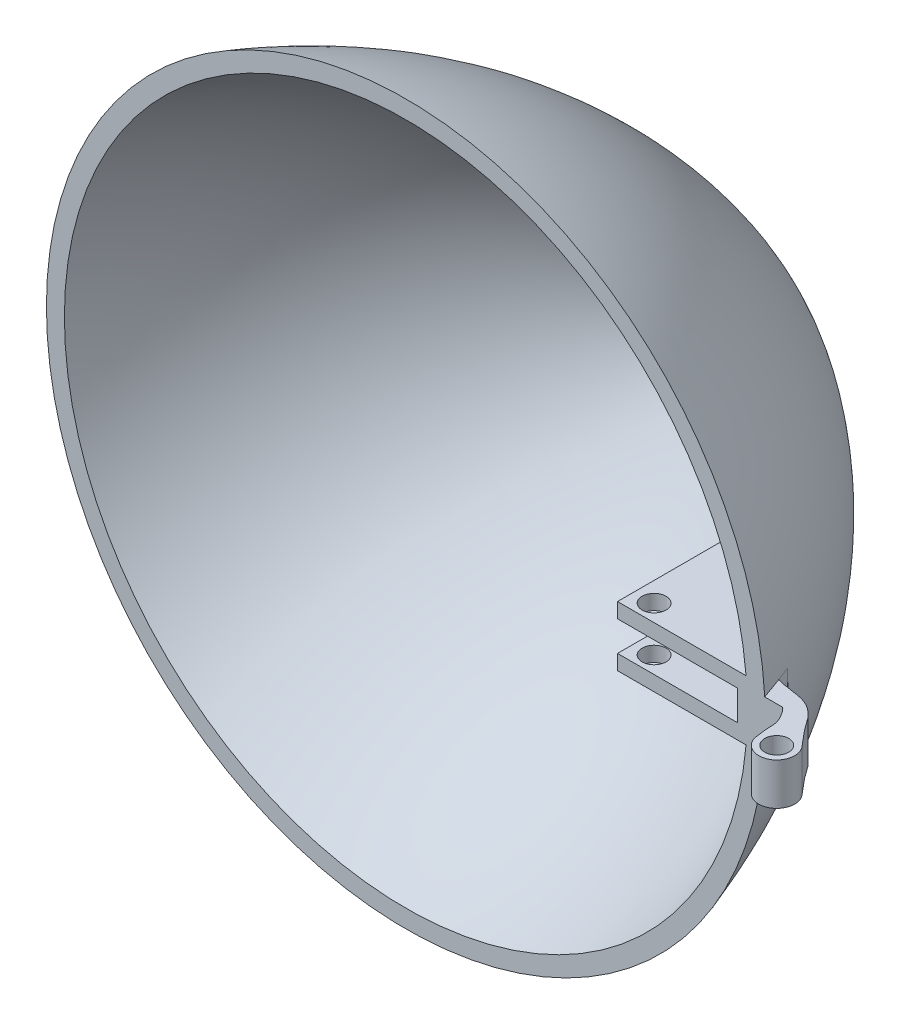
ISO-10303-21;
HEADER;
FILE_DESCRIPTION(('STEP AP214'),'2;1');
FILE_NAME('part.step','',(''),(''),'','','');
FILE_SCHEMA(('AUTOMOTIVE_DESIGN { 1 0 10303 214 1 1 1 1 }'));
ENDSEC;
DATA;
#1=APPLICATION_CONTEXT('core data for automotive mechanical design processes');
#2=APPLICATION_PROTOCOL_DEFINITION('international standard','automotive_design',2000,#1);
#3=PRODUCT_CONTEXT('',#1,'mechanical');
#4=PRODUCT('Part','Part','',(#3));
#5=PRODUCT_RELATED_PRODUCT_CATEGORY('part','',(#4));
#6=PRODUCT_DEFINITION_FORMATION('','',#4);
#7=PRODUCT_DEFINITION_CONTEXT('part definition',#1,'design');
#8=PRODUCT_DEFINITION('design','',#6,#7);
#9=PRODUCT_DEFINITION_SHAPE('','',#8);
#10=(LENGTH_UNIT() NAMED_UNIT(*) SI_UNIT(.MILLI.,.METRE.));
#11=(NAMED_UNIT(*) PLANE_ANGLE_UNIT() SI_UNIT($,.RADIAN.));
#12=(NAMED_UNIT(*) SI_UNIT($,.STERADIAN.) SOLID_ANGLE_UNIT());
#13=UNCERTAINTY_MEASURE_WITH_UNIT(LENGTH_MEASURE(1.E-05),#10,'distance_accuracy_value','');
#14=(GEOMETRIC_REPRESENTATION_CONTEXT(3) GLOBAL_UNCERTAINTY_ASSIGNED_CONTEXT((#13)) GLOBAL_UNIT_ASSIGNED_CONTEXT((#10,
#11,#12)) REPRESENTATION_CONTEXT('',''));
#15=CARTESIAN_POINT('',(0.,0.,0.));
#16=DIRECTION('',(0.,0.,1.));
#17=DIRECTION('',(1.,0.,0.));
#18=AXIS2_PLACEMENT_3D('',#15,#16,#17);
#19=CARTESIAN_POINT('',(17.6619486107275,2.5,-30.002));
#20=DIRECTION('',(-1.,0.,0.));
#21=DIRECTION('',(0.,0.,1.));
#22=AXIS2_PLACEMENT_3D('',#19,#20,#21);
#23=PLANE('',#22);
#24=DIRECTION('',(0.,0.,1.));
#25=VECTOR('',#24,1.);
#26=CARTESIAN_POINT('',(17.6619486107275,1.25,-30.003));
#27=LINE('',#26,#25);
#28=CARTESIAN_POINT('',(17.6619486107275,1.25,-17.5607541889131));
#29=VERTEX_POINT('',#28);
#30=CARTESIAN_POINT('',(17.6619486107275,1.25,0.));
#31=VERTEX_POINT('',#30);
#32=EDGE_CURVE('E103',#29,#31,#27,.T.);
#33=ORIENTED_EDGE('',*,*,#32,.T.);
#34=DIRECTION('',(0.,-1.,0.));
#35=VECTOR('',#34,1.);
#36=CARTESIAN_POINT('',(17.6619486107275,2.5,0.));
#37=LINE('',#36,#35);
#38=CARTESIAN_POINT('',(17.6619486107275,2.5,0.));
#39=VERTEX_POINT('',#38);
#40=EDGE_CURVE('E216',#39,#31,#37,.T.);
#41=ORIENTED_EDGE('',*,*,#40,.F.);
#42=DIRECTION('',(0.,0.,1.));
#43=VECTOR('',#42,1.);
#44=CARTESIAN_POINT('',(17.6619486107275,2.5,-30.002));
#45=LINE('',#44,#43);
#46=CARTESIAN_POINT('',(17.6619486107275,2.5,-17.4275613271101));
#47=VERTEX_POINT('',#46);
#48=EDGE_CURVE('E228',#47,#39,#45,.T.);
#49=ORIENTED_EDGE('',*,*,#48,.F.);
#50=CARTESIAN_POINT('',(17.6619486107275,-2.5,-17.4275613271101));
#51=CARTESIAN_POINT('',(17.6619486107275,-2.33364452662842,-17.4512148888771));
#52=CARTESIAN_POINT('',(17.6619486107275,-2.16695716753275,-17.4725414811833));
#53=CARTESIAN_POINT('',(17.6619486107275,-1.8335800516303,-17.5104322515211));
#54=CARTESIAN_POINT('',(17.6619486107275,-1.66689199384202,-17.5270113835337));
#55=CARTESIAN_POINT('',(17.6619486107275,-1.33351393835268,-17.5554158855967));
#56=CARTESIAN_POINT('',(17.6619486107275,-1.16682490558671,-17.5672525700897));
#57=CARTESIAN_POINT('',(17.6619486107275,-0.833446184973771,-17.5861817283973));
#58=CARTESIAN_POINT('',(17.6619486107275,-0.666756928281093,-17.5932817923936));
#59=CARTESIAN_POINT('',(17.6619486107275,-0.333378375504051,-17.6027443708301));
#60=CARTESIAN_POINT('',(17.6619486107275,-0.166689187752026,-17.6051106993557));
#61=CARTESIAN_POINT('',(17.6619486107275,0.166689187752024,-17.6051106993557));
#62=CARTESIAN_POINT('',(17.6619486107275,0.333378375504049,-17.6027443708301));
#63=CARTESIAN_POINT('',(17.6619486107275,0.66675692828109,-17.5932817923936));
#64=CARTESIAN_POINT('',(17.6619486107275,0.833446184973769,-17.5861817283973));
#65=CARTESIAN_POINT('',(17.6619486107275,1.16682490558671,-17.5672525700897));
#66=CARTESIAN_POINT('',(17.6619486107275,1.33351393835267,-17.5554158855967));
#67=CARTESIAN_POINT('',(17.6619486107275,1.66689199384202,-17.5270113835337));
#68=CARTESIAN_POINT('',(17.6619486107275,1.8335800516303,-17.5104322515211));
#69=CARTESIAN_POINT('',(17.6619486107275,2.16695716753275,-17.4725414811833));
#70=CARTESIAN_POINT('',(17.6619486107275,2.33364452662842,-17.4512148888771));
#71=CARTESIAN_POINT('',(17.6619486107275,2.5,-17.4275613271101));
#72=B_SPLINE_CURVE_WITH_KNOTS('',3,(#50,#51,#52,#53,#54,#55,#56,#57,#58,#59,#60,#61,#62,#63,#64,
#65,#66,#67,#68,#69,#70,#71),.UNSPECIFIED.,.F.,.F.,(4,2,2,2,2,2,2,2,2,2,4),(0.,
0.504071068011739,1.00653644814482,1.50779581357835,2.00824999575827,2.50830078720154,
3.00835157864481,3.50880576082473,4.01006512625825,4.51253050639134,5.01660157440307),.UNSPECIFIED.);
#73=EDGE_CURVE('E263',#29,#47,#72,.T.);
#74=ORIENTED_EDGE('',*,*,#73,.F.);
#75=EDGE_LOOP('',(#33,#41,#49,#74));
#76=FACE_BOUND('',#75,.T.);
#77=ADVANCED_FACE('F84',(#76),#23,.T.);
#78=CARTESIAN_POINT('',(19.3038889824878,30.001,-1.41072564130724));
#79=DIRECTION('',(0.,-1.,0.));
#80=DIRECTION('',(0.,0.,-1.));
#81=AXIS2_PLACEMENT_3D('',#78,#79,#80);
#82=CYLINDRICAL_SURFACE('',#81,1.);
#83=CARTESIAN_POINT('',(19.3038889824878,1.25,-1.41072564130724));
#84=DIRECTION('',(0.,1.,0.));
#85=DIRECTION('',(0.,0.,1.));
#86=AXIS2_PLACEMENT_3D('',#83,#84,#85);
#87=CIRCLE('',#86,1.);
#88=CARTESIAN_POINT('',(19.3038889824878,1.25,-0.410725641307243));
#89=VERTEX_POINT('',#88);
#90=EDGE_CURVE('E90',#89,#89,#87,.F.);
#91=ORIENTED_EDGE('',*,*,#90,.T.);
#92=EDGE_LOOP('',(#91));
#93=FACE_BOUND('',#92,.T.);
#94=CARTESIAN_POINT('',(19.3038889824878,2.5,-1.41072564130724));
#95=DIRECTION('',(0.,1.,0.));
#96=DIRECTION('',(0.,0.,1.));
#97=AXIS2_PLACEMENT_3D('',#94,#95,#96);
#98=CIRCLE('',#97,1.);
#99=CARTESIAN_POINT('',(19.3038889824878,2.5,-0.410725641307243));
#100=VERTEX_POINT('',#99);
#101=EDGE_CURVE('E569',#100,#100,#98,.F.);
#102=ORIENTED_EDGE('',*,*,#101,.F.);
#103=EDGE_LOOP('',(#102));
#104=FACE_BOUND('',#103,.T.);
#105=ADVANCED_FACE('F280',(#93,#104),#82,.F.);
#106=CARTESIAN_POINT('',(28.208129485491,1.75,-3.));
#107=DIRECTION('',(0.,1.,0.));
#108=DIRECTION('',(0.,0.,1.));
#109=AXIS2_PLACEMENT_3D('',#106,#107,#108);
#110=PLANE('',#109);
#111=CARTESIAN_POINT('',(33.9489148384378,1.75,3.));
#112=DIRECTION('',(0.,1.,0.));
#113=DIRECTION('',(0.,0.,1.));
#114=AXIS2_PLACEMENT_3D('',#111,#112,#113);
#115=CIRCLE('',#114,0.999999999999998);
#116=CARTESIAN_POINT('',(33.9489148384378,1.75,4.));
#117=VERTEX_POINT('',#116);
#118=EDGE_CURVE('E336',#117,#117,#115,.T.);
#119=ORIENTED_EDGE('',*,*,#118,.F.);
#120=EDGE_LOOP('',(#119));
#121=FACE_BOUND('',#120,.T.);
#122=CARTESIAN_POINT('',(28.8289906398202,1.75,-3.));
#123=CARTESIAN_POINT('',(28.8958930428877,1.75,-2.83510517042609));
#124=CARTESIAN_POINT('',(28.9620019711612,1.75,-2.66988864593124));
#125=CARTESIAN_POINT('',(29.0926355045824,1.75,-2.33886351445349));
#126=CARTESIAN_POINT('',(29.1571603825275,1.75,-2.17305501513178));
#127=CARTESIAN_POINT('',(29.2846462643894,1.75,-1.84085403238236));
#128=CARTESIAN_POINT('',(29.3476073997087,1.75,-1.67446159937317));
#129=CARTESIAN_POINT('',(29.4719856416756,1.75,-1.3411012629893));
#130=CARTESIAN_POINT('',(29.5334027528663,1.75,-1.17413336130943));
#131=CARTESIAN_POINT('',(29.6547130858508,1.75,-0.839628492746256));
#132=CARTESIAN_POINT('',(29.714606174192,1.75,-0.672091477474023));
#133=CARTESIAN_POINT('',(29.8328879495773,1.75,-0.336455215599502));
#134=CARTESIAN_POINT('',(29.8912763794571,1.75,-0.168355878364052));
#135=CARTESIAN_POINT('',(29.9489148384378,1.75,0.));
#136=B_SPLINE_CURVE_WITH_KNOTS('',3,(#122,#123,#124,#125,#126,#127,#128,#129,#130,#131,#132,
#133,#134,#135),.UNSPECIFIED.,.F.,.F.,(4,2,2,2,2,2,4),(0.,0.533847900146102,1.0676032093434,
1.60131351394715,2.135022248059,2.66877755720198,3.20262349452704),.UNSPECIFIED.);
#137=CARTESIAN_POINT('',(29.2879120528032,1.75,-1.83149184484965));
#138=VERTEX_POINT('',#137);
#139=CARTESIAN_POINT('',(29.9489148384378,1.75,0.));
#140=VERTEX_POINT('',#139);
#141=EDGE_CURVE('E298',#138,#140,#136,.T.);
#142=ORIENTED_EDGE('',*,*,#141,.T.);
#143=DIRECTION('',(1.,0.,0.));
#144=VECTOR('',#143,1.);
#145=CARTESIAN_POINT('',(0.,1.75,0.));
#146=LINE('',#145,#144);
#147=CARTESIAN_POINT('',(31.4313327643912,1.75,-7.66703696787174E-10));
#148=VERTEX_POINT('',#147);
#149=EDGE_CURVE('E376',#140,#148,#146,.T.);
#150=ORIENTED_EDGE('',*,*,#149,.T.);
#151=CARTESIAN_POINT('',(32.463099635242,1.75,3.20579888714997));
#152=CARTESIAN_POINT('',(32.3452183472964,1.75,2.53893952637464));
#153=CARTESIAN_POINT('',(32.3358643431977,1.75,1.83818950671229));
#154=CARTESIAN_POINT('',(32.3239378931179,1.75,1.53750983419818));
#155=CARTESIAN_POINT('',(32.2207148251797,1.75,1.14850300274605));
#156=CARTESIAN_POINT('',(32.0474459292414,1.75,0.783027828767226));
#157=CARTESIAN_POINT('',(31.2805712905834,1.75,-0.484912370915835));
#158=CARTESIAN_POINT('',(30.8417224009911,1.75,-0.0233901476595534));
#159=CARTESIAN_POINT('',(29.9489148384378,1.75,0.));
#160=B_SPLINE_CURVE_WITH_KNOTS('',3,(#151,#152,#153,#154,#155,#156,#157,#158,#159),
.UNSPECIFIED.,.F.,.F.,(4,1,1,1,1,1,4),(0.760748360647624,0.802714162680243,0.833252761763399,
0.866534985901637,0.873756945371258,0.905472356459606,1.),.UNSPECIFIED.);
#161=CARTESIAN_POINT('',(32.463099635242,1.75,3.20579888714997));
#162=VERTEX_POINT('',#161);
#163=EDGE_CURVE('E386',#162,#148,#160,.T.);
#164=ORIENTED_EDGE('',*,*,#163,.F.);
#165=CARTESIAN_POINT('',(33.9489148384378,1.75,3.));
#166=DIRECTION('',(0.,1.,0.));
#167=DIRECTION('',(0.,0.,1.));
#168=AXIS2_PLACEMENT_3D('',#165,#166,#167);
#169=CIRCLE('',#168,1.5);
#170=CARTESIAN_POINT('',(35.0280654497554,1.75,1.958158381474));
#171=VERTEX_POINT('',#170);
#172=EDGE_CURVE('E383',#162,#171,#169,.T.);
#173=ORIENTED_EDGE('',*,*,#172,.T.);
#174=CARTESIAN_POINT('',(29.2879120528032,1.75,-1.83149184484968));
#175=CARTESIAN_POINT('',(30.1235676782013,1.75,-1.5620717663439));
#176=CARTESIAN_POINT('',(31.4982305797862,1.75,-1.64009568049671));
#177=CARTESIAN_POINT('',(32.9560632797869,1.75,-0.719190623688149));
#178=CARTESIAN_POINT('',(33.6422187716804,1.75,0.196212236466457));
#179=CARTESIAN_POINT('',(34.1195707770958,1.75,0.930905219807041));
#180=CARTESIAN_POINT('',(34.8127024054398,1.75,1.70003850267874));
#181=CARTESIAN_POINT('',(35.0280654497554,1.75,1.95815838147401));
#182=B_SPLINE_CURVE_WITH_KNOTS('',3,(#174,#175,#176,#177,#178,#179,#180,#181),.UNSPECIFIED.,.F.,
.F.,(4,1,1,1,1,4),(0.,0.153474464426335,0.218322405433181,0.290372076581156,0.338209132320418,
0.39567089543696),.UNSPECIFIED.);
#183=EDGE_CURVE('E382',#138,#171,#182,.T.);
#184=ORIENTED_EDGE('',*,*,#183,.F.);
#185=EDGE_LOOP('',(#142,#150,#164,#173,#184));
#186=FACE_BOUND('',#185,.T.);
#187=ADVANCED_FACE('F285',(#121,#186),#110,.T.);
#188=CARTESIAN_POINT('',(28.208129485491,-1.75,-3.));
#189=DIRECTION('',(0.,-1.,0.));
#190=DIRECTION('',(0.,0.,-1.));
#191=AXIS2_PLACEMENT_3D('',#188,#189,#190);
#192=PLANE('',#191);
#193=CARTESIAN_POINT('',(33.9489148384378,-1.75,3.));
#194=DIRECTION('',(0.,-1.,0.));
#195=DIRECTION('',(0.,0.,-1.));
#196=AXIS2_PLACEMENT_3D('',#193,#194,#195);
#197=CIRCLE('',#196,0.999999999999998);
#198=CARTESIAN_POINT('',(33.9489148384378,-1.75,4.));
#199=VERTEX_POINT('',#198);
#200=EDGE_CURVE('E313',#199,#199,#197,.T.);
#201=ORIENTED_EDGE('',*,*,#200,.F.);
#202=EDGE_LOOP('',(#201));
#203=FACE_BOUND('',#202,.T.);
#204=CARTESIAN_POINT('',(32.463099635242,-1.75,3.20579888714997));
#205=CARTESIAN_POINT('',(32.3452183472964,-1.75,2.53893952637464));
#206=CARTESIAN_POINT('',(32.3358643431977,-1.75,1.83818950671229));
#207=CARTESIAN_POINT('',(32.3239378931179,-1.75,1.53750983419818));
#208=CARTESIAN_POINT('',(32.2207148251797,-1.75,1.14850300274605));
#209=CARTESIAN_POINT('',(32.0474459292414,-1.75,0.783027828767226));
#210=CARTESIAN_POINT('',(31.2805712905834,-1.75,-0.484912370915835));
#211=CARTESIAN_POINT('',(30.8417224009911,-1.75,-0.0233901476595534));
#212=CARTESIAN_POINT('',(29.9489148384378,-1.75,0.));
#213=B_SPLINE_CURVE_WITH_KNOTS('',3,(#204,#205,#206,#207,#208,#209,#210,#211,#212),
.UNSPECIFIED.,.F.,.F.,(4,1,1,1,1,1,4),(0.760748360647624,0.802714162680243,0.833252761763399,
0.866534985901637,0.873756945371258,0.905472356459606,1.),.UNSPECIFIED.);
#214=CARTESIAN_POINT('',(31.4313327643912,-1.75,-7.66703696787174E-10));
#215=VERTEX_POINT('',#214);
#216=CARTESIAN_POINT('',(32.463099635242,-1.75,3.20579888714997));
#217=VERTEX_POINT('',#216);
#218=EDGE_CURVE('E95',#215,#217,#213,.F.);
#219=ORIENTED_EDGE('',*,*,#218,.F.);
#220=DIRECTION('',(-1.,0.,0.));
#221=VECTOR('',#220,1.);
#222=CARTESIAN_POINT('',(28.208129485491,-1.75,0.));
#223=LINE('',#222,#221);
#224=CARTESIAN_POINT('',(29.9489148384378,-1.75,0.));
#225=VERTEX_POINT('',#224);
#226=EDGE_CURVE('E12',#215,#225,#223,.T.);
#227=ORIENTED_EDGE('',*,*,#226,.T.);
#228=CARTESIAN_POINT('',(29.9489148384378,-1.75,0.));
#229=CARTESIAN_POINT('',(29.8912763794571,-1.75,-0.168355878364052));
#230=CARTESIAN_POINT('',(29.8328879495773,-1.75,-0.336455215599503));
#231=CARTESIAN_POINT('',(29.714606174192,-1.75,-0.672091477474024));
#232=CARTESIAN_POINT('',(29.6547130858508,-1.75,-0.839628492746256));
#233=CARTESIAN_POINT('',(29.5334027528663,-1.75,-1.17413336130943));
#234=CARTESIAN_POINT('',(29.4719856416756,-1.75,-1.3411012629893));
#235=CARTESIAN_POINT('',(29.3476073997087,-1.75,-1.67446159937317));
#236=CARTESIAN_POINT('',(29.2846462643894,-1.75,-1.84085403238236));
#237=CARTESIAN_POINT('',(29.1571603825275,-1.75,-2.17305501513178));
#238=CARTESIAN_POINT('',(29.0926355045824,-1.75,-2.33886351445349));
#239=CARTESIAN_POINT('',(28.9620019711612,-1.75,-2.66988864593124));
#240=CARTESIAN_POINT('',(28.8958930428877,-1.75,-2.83510517042609));
#241=CARTESIAN_POINT('',(28.8289906398202,-1.75000000000001,-3.));
#242=B_SPLINE_CURVE_WITH_KNOTS('',3,(#228,#229,#230,#231,#232,#233,#234,#235,#236,#237,#238,
#239,#240,#241),.UNSPECIFIED.,.F.,.F.,(4,2,2,2,2,2,4),(0.,0.533845937325056,1.06760124646804,
1.60130998057989,2.13502028518364,2.66877559438094,3.20262349452704),.UNSPECIFIED.);
#243=CARTESIAN_POINT('',(29.2879081029253,-1.75,-1.83149037032838));
#244=VERTEX_POINT('',#243);
#245=EDGE_CURVE('E290',#225,#244,#242,.T.);
#246=ORIENTED_EDGE('',*,*,#245,.T.);
#247=CARTESIAN_POINT('',(29.2879120528032,-1.75,-1.83149184484968));
#248=CARTESIAN_POINT('',(30.1235676782013,-1.75,-1.5620717663439));
#249=CARTESIAN_POINT('',(31.4982305797862,-1.75,-1.64009568049671));
#250=CARTESIAN_POINT('',(32.9560632797869,-1.75,-0.719190623688149));
#251=CARTESIAN_POINT('',(33.6422187716804,-1.75,0.196212236466457));
#252=CARTESIAN_POINT('',(34.1195707770958,-1.75,0.930905219807041));
#253=CARTESIAN_POINT('',(34.8127024054398,-1.75,1.70003850267874));
#254=CARTESIAN_POINT('',(35.0280654497554,-1.75,1.95815838147401));
#255=B_SPLINE_CURVE_WITH_KNOTS('',3,(#247,#248,#249,#250,#251,#252,#253,#254),.UNSPECIFIED.,.F.,
.F.,(4,1,1,1,1,4),(0.,0.153474464426335,0.218322405433181,0.290372076581156,0.338209132320418,
0.39567089543696),.UNSPECIFIED.);
#256=CARTESIAN_POINT('',(35.0280654497554,-1.75,1.958158381474));
#257=VERTEX_POINT('',#256);
#258=EDGE_CURVE('E317',#257,#244,#255,.F.);
#259=ORIENTED_EDGE('',*,*,#258,.F.);
#260=CARTESIAN_POINT('',(33.9489148384378,-1.75,3.));
#261=DIRECTION('',(0.,-1.,0.));
#262=DIRECTION('',(0.,0.,-1.));
#263=AXIS2_PLACEMENT_3D('',#260,#261,#262);
#264=CIRCLE('',#263,1.5);
#265=EDGE_CURVE('E588',#257,#217,#264,.T.);
#266=ORIENTED_EDGE('',*,*,#265,.T.);
#267=EDGE_LOOP('',(#219,#227,#246,#259,#266));
#268=FACE_BOUND('',#267,.T.);
#269=ADVANCED_FACE('F281',(#203,#268),#192,.T.);
#270=CARTESIAN_POINT('',(0.,0.,-30.));
#271=CARTESIAN_POINT('',(-22.3404647460289,0.,-22.4108545765137));
#272=CARTESIAN_POINT('',(-30.,0.,0.));
#273=B_SPLINE_CURVE_WITH_KNOTS('',2,(#270,#271,#272),.UNSPECIFIED.,.F.,.F.,(3,3),(0.,1.),.UNSPECIFIED.);
#274=CARTESIAN_POINT('',(0.,0.,-30.));
#275=DIRECTION('',(0.,0.,-1.));
#276=AXIS1_PLACEMENT('',#274,#275);
#277=SURFACE_OF_REVOLUTION('',#273,#276);
#278=CARTESIAN_POINT('',(28.8289906398202,1.75,-3.));
#279=CARTESIAN_POINT('',(28.9863572725946,1.75,-2.61213715990917));
#280=CARTESIAN_POINT('',(29.1392880185995,1.75,-2.22261836750651));
#281=CARTESIAN_POINT('',(29.2879120528032,1.75,-1.83149184484966));
#282=B_SPLINE_CURVE_WITH_KNOTS('',3,(#278,#279,#280,#281),.UNSPECIFIED.,.F.,.F.,(4,4),(0.,
0.391982779647387),.UNSPECIFIED.);
#283=CARTESIAN_POINT('',(28.8289906398202,1.75,-3.));
#284=VERTEX_POINT('',#283);
#285=EDGE_CURVE('E312',#284,#138,#282,.T.);
#286=ORIENTED_EDGE('',*,*,#285,.F.);
#287=CARTESIAN_POINT('',(0.,0.,-3.00000000000001));
#288=DIRECTION('',(0.,0.,-1.));
#289=DIRECTION('',(-1.,0.,0.));
#290=AXIS2_PLACEMENT_3D('',#287,#288,#289);
#291=CIRCLE('',#290,28.8820567361613);
#292=CARTESIAN_POINT('',(28.8289906398202,-1.75,-3.));
#293=VERTEX_POINT('',#292);
#294=EDGE_CURVE('E314',#284,#293,#291,.T.);
#295=ORIENTED_EDGE('',*,*,#294,.T.);
#296=EDGE_CURVE('E299',#244,#293,#242,.T.);
#297=ORIENTED_EDGE('',*,*,#296,.F.);
#298=ORIENTED_EDGE('',*,*,#245,.F.);
#299=CARTESIAN_POINT('',(0.,0.,0.));
#300=DIRECTION('',(0.,0.,-1.));
#301=DIRECTION('',(-1.,0.,0.));
#302=AXIS2_PLACEMENT_3D('',#299,#300,#301);
#303=CIRCLE('',#302,30.);
#304=EDGE_CURVE('E318',#225,#140,#303,.T.);
#305=ORIENTED_EDGE('',*,*,#304,.T.);
#306=ORIENTED_EDGE('',*,*,#141,.F.);
#307=EDGE_LOOP('',(#286,#295,#297,#298,#305,#306));
#308=FACE_BOUND('',#307,.T.);
#309=CARTESIAN_POINT('',(0.,0.,-30.));
#310=VERTEX_POINT('',#309);
#311=VERTEX_LOOP('',#310);
#312=FACE_BOUND('',#311,.T.);
#313=ADVANCED_FACE('F86',(#308,#312),#277,.F.);
#314=CARTESIAN_POINT('',(-30.,0.,0.));
#315=DIRECTION('',(0.,0.,1.));
#316=DIRECTION('',(1.,0.,0.));
#317=AXIS2_PLACEMENT_3D('',#314,#315,#316);
#318=PLANE('',#317);
#319=DIRECTION('',(-1.,0.,0.));
#320=VECTOR('',#319,1.);
#321=CARTESIAN_POINT('',(17.6619486107275,1.25,0.));
#322=LINE('',#321,#320);
#323=CARTESIAN_POINT('',(27.6619486107275,1.25,0.));
#324=VERTEX_POINT('',#323);
#325=EDGE_CURVE('E201',#324,#31,#322,.T.);
#326=ORIENTED_EDGE('',*,*,#325,.F.);
#327=DIRECTION('',(0.,1.,0.));
#328=VECTOR('',#327,1.);
#329=CARTESIAN_POINT('',(27.6619486107275,1.25,0.));
#330=LINE('',#329,#328);
#331=CARTESIAN_POINT('',(27.6619486107275,-1.25,0.));
#332=VERTEX_POINT('',#331);
#333=EDGE_CURVE('E210',#332,#324,#330,.T.);
#334=ORIENTED_EDGE('',*,*,#333,.F.);
#335=DIRECTION('',(1.,0.,0.));
#336=VECTOR('',#335,1.);
#337=CARTESIAN_POINT('',(17.6619486107275,-1.25,0.));
#338=LINE('',#337,#336);
#339=CARTESIAN_POINT('',(17.6619486107275,-1.25,0.));
#340=VERTEX_POINT('',#339);
#341=EDGE_CURVE('E193',#340,#332,#338,.T.);
#342=ORIENTED_EDGE('',*,*,#341,.F.);
#343=CARTESIAN_POINT('',(17.6619486107275,-2.5,0.));
#344=VERTEX_POINT('',#343);
#345=EDGE_CURVE('E207',#340,#344,#37,.T.);
#346=ORIENTED_EDGE('',*,*,#345,.T.);
#347=DIRECTION('',(1.,0.,0.));
#348=VECTOR('',#347,1.);
#349=CARTESIAN_POINT('',(17.6619486107275,-2.5,0.));
#350=LINE('',#349,#348);
#351=CARTESIAN_POINT('',(28.3901391331568,-2.5,0.));
#352=VERTEX_POINT('',#351);
#353=EDGE_CURVE('E220',#344,#352,#350,.T.);
#354=ORIENTED_EDGE('',*,*,#353,.T.);
#355=CARTESIAN_POINT('',(0.,0.,0.));
#356=DIRECTION('',(0.,0.,-1.));
#357=DIRECTION('',(-1.,0.,0.));
#358=AXIS2_PLACEMENT_3D('',#355,#356,#357);
#359=CIRCLE('',#358,28.5);
#360=CARTESIAN_POINT('',(28.3901391331568,2.5,0.));
#361=VERTEX_POINT('',#360);
#362=EDGE_CURVE('E450',#352,#361,#359,.T.);
#363=ORIENTED_EDGE('',*,*,#362,.T.);
#364=DIRECTION('',(-1.,0.,0.));
#365=VECTOR('',#364,1.);
#366=CARTESIAN_POINT('',(29.6619486107275,2.5,0.));
#367=LINE('',#366,#365);
#368=EDGE_CURVE('E217',#361,#39,#367,.T.);
#369=ORIENTED_EDGE('',*,*,#368,.T.);
#370=ORIENTED_EDGE('',*,*,#40,.T.);
#371=EDGE_LOOP('',(#326,#334,#342,#346,#354,#363,#369,#370));
#372=FACE_BOUND('',#371,.T.);
#373=ORIENTED_EDGE('',*,*,#149,.F.);
#374=ORIENTED_EDGE('',*,*,#304,.F.);
#375=ORIENTED_EDGE('',*,*,#226,.F.);
#376=DIRECTION('',(0.,1.,0.));
#377=VECTOR('',#376,1.);
#378=CARTESIAN_POINT('',(31.4313327643912,-4.25,-7.66703696787174E-10));
#379=LINE('',#378,#377);
#380=EDGE_CURVE('E392',#215,#148,#379,.T.);
#381=ORIENTED_EDGE('',*,*,#380,.T.);
#382=EDGE_LOOP('',(#373,#374,#375,#381));
#383=FACE_BOUND('',#382,.T.);
#384=ADVANCED_FACE('F205',(#372,#383),#318,.T.);
#385=CARTESIAN_POINT('',(-28.5,0.,0.));
#386=CARTESIAN_POINT('',(-20.9973824686727,0.,-21.0368338259722));
#387=CARTESIAN_POINT('',(0.,0.,-28.5));
#388=B_SPLINE_CURVE_WITH_KNOTS('',2,(#385,#386,#387),.UNSPECIFIED.,.F.,.F.,(3,3),(0.,1.),.UNSPECIFIED.);
#389=CARTESIAN_POINT('',(0.,0.,-30.));
#390=DIRECTION('',(0.,0.,-1.));
#391=AXIS1_PLACEMENT('',#389,#390);
#392=SURFACE_OF_REVOLUTION('',#388,#391);
#393=CARTESIAN_POINT('',(28.3901391331568,-2.5,0.));
#394=CARTESIAN_POINT('',(28.2761797427918,-2.5,-0.318303664785641));
#395=CARTESIAN_POINT('',(28.1594126621019,-2.5,-0.635605222148375));
#396=CARTESIAN_POINT('',(27.9201777826389,-2.5,-1.26800399495369));
#397=CARTESIAN_POINT('',(27.79771073163,-2.5,-1.58310149333726));
#398=CARTESIAN_POINT('',(27.5469712538878,-2.5,-2.21094923501268));
#399=CARTESIAN_POINT('',(27.4186993115721,-2.5,-2.5236996716366));
#400=CARTESIAN_POINT('',(27.1571453352822,-2.5,-3.14457823858145));
#401=CARTESIAN_POINT('',(27.0239036333325,-2.5,-3.45272335637143));
#402=CARTESIAN_POINT('',(26.7514925995644,-2.5,-4.0664173682034));
#403=CARTESIAN_POINT('',(26.6123227432744,-2.5,-4.37196602965309));
#404=CARTESIAN_POINT('',(26.3279595416507,-2.5,-4.98032309185413));
#405=CARTESIAN_POINT('',(26.1827649145775,-2.5,-5.28313089263657));
#406=CARTESIAN_POINT('',(25.7688600157096,-2.5,-6.12449936057967));
#407=CARTESIAN_POINT('',(25.493427284752,-2.5,-6.65977500658508));
#408=CARTESIAN_POINT('',(24.9226426631703,-2.5,-7.71979878163039));
#409=CARTESIAN_POINT('',(24.6272849190517,-2.5,-8.24454375775038));
#410=CARTESIAN_POINT('',(24.0164766978052,-2.5,-9.2822522581527));
#411=CARTESIAN_POINT('',(23.7010253457032,-2.5,-9.79521526806538));
#412=CARTESIAN_POINT('',(23.0499687653028,-2.5,-10.8081461618884));
#413=CARTESIAN_POINT('',(22.7143649371934,-2.5,-11.3081149451839));
#414=CARTESIAN_POINT('',(22.0174076169383,-2.5,-12.3019562796292));
#415=CARTESIAN_POINT('',(21.6557243190098,-2.5,-12.7955977528398));
#416=CARTESIAN_POINT('',(20.9117566724949,-2.5,-13.7671530767315));
#417=CARTESIAN_POINT('',(20.5294712493726,-2.5,-14.2450661049731));
#418=CARTESIAN_POINT('',(19.7445534527305,-2.5,-15.1841519921633));
#419=CARTESIAN_POINT('',(19.3419145317348,-2.5,-15.6453193812039));
#420=CARTESIAN_POINT('',(18.5166953779824,-2.5,-16.5500197898396));
#421=CARTESIAN_POINT('',(18.0941019040887,-2.50000000000001,-16.9935407298038));
#422=CARTESIAN_POINT('',(17.6619486107275,-2.50000000000002,-17.4275613271101));
#423=B_SPLINE_CURVE_WITH_KNOTS('',3,(#393,#394,#395,#396,#397,#398,#399,#400,#401,#402,#403,
#404,#405,#406,#407,#408,#409,#410,#411,#412,#413,#414,#415,#416,#417,#418,#419,#420,#421,#422),
.UNSPECIFIED.,.F.,.F.,(4,2,2,2,2,2,2,2,2,2,2,2,2,2,4),(0.,1.0142572286569,2.02838177254209,
3.04242184332423,4.04951663022824,5.05670070193203,6.06410015673496,7.86961127802926,
9.67565514499982,11.4817777097992,13.2877749305396,15.1231188916463,16.9585586707882,
18.7945926936063,20.6318626513637),.UNSPECIFIED.);
#424=CARTESIAN_POINT('',(17.6619486107275,-2.5,-17.4275613271101));
#425=VERTEX_POINT('',#424);
#426=EDGE_CURVE('E235',#352,#425,#423,.T.);
#427=ORIENTED_EDGE('',*,*,#426,.T.);
#428=CARTESIAN_POINT('',(17.6619486107275,-1.25,-17.5607541889131));
#429=VERTEX_POINT('',#428);
#430=EDGE_CURVE('E258',#425,#429,#72,.T.);
#431=ORIENTED_EDGE('',*,*,#430,.T.);
#432=CARTESIAN_POINT('',(27.6619486107274,-1.25,-2.13392362014184));
#433=CARTESIAN_POINT('',(27.5371281004954,-1.25,-2.4432273092908));
#434=CARTESIAN_POINT('',(27.4094713451364,-1.25,-2.75138952654104));
#435=CARTESIAN_POINT('',(27.1484111917662,-1.25,-3.36524177794646));
#436=CARTESIAN_POINT('',(27.0150082345831,-1.25,-3.67093199961482));
#437=CARTESIAN_POINT('',(26.7423700471536,-1.25,-4.27968144420557));
#438=CARTESIAN_POINT('',(26.6031351430636,-1.25,-4.58274081311923));
#439=CARTESIAN_POINT('',(26.3196527697394,-1.25,-5.18415927320823));
#440=CARTESIAN_POINT('',(26.1754426876626,-1.25,-5.48253598386483));
#441=CARTESIAN_POINT('',(25.8811071119363,-1.25,-6.07638169226976));
#442=CARTESIAN_POINT('',(25.7309812639993,-1.25,-6.37185051454004));
#443=CARTESIAN_POINT('',(25.424743208573,-1.25,-6.95972512427092));
#444=CARTESIAN_POINT('',(25.2686300734553,-1.24999999999999,-7.25213042808337));
#445=CARTESIAN_POINT('',(24.8606877373293,-1.24999999999999,-7.99756106983192));
#446=CARTESIAN_POINT('',(24.6045082770693,-1.25,-8.44821654442079));
#447=CARTESIAN_POINT('',(24.0772569974874,-1.25,-9.34085576152718));
#448=CARTESIAN_POINT('',(23.8061820409968,-1.25,-9.78283765047738));
#449=CARTESIAN_POINT('',(23.2491104902643,-1.25,-10.6573373659217));
#450=CARTESIAN_POINT('',(22.9631130866447,-1.25,-11.0898546772575));
#451=CARTESIAN_POINT('',(22.3762366317689,-1.25,-11.944662228094));
#452=CARTESIAN_POINT('',(22.075357911012,-1.25,-12.3669526944127));
#453=CARTESIAN_POINT('',(21.4547544448573,-1.25,-13.2060906782841));
#454=CARTESIAN_POINT('',(21.1348337418016,-1.25,-13.6227933534367));
#455=CARTESIAN_POINT('',(20.4800047335609,-1.25,-14.444266781773));
#456=CARTESIAN_POINT('',(20.1450961616848,-1.25,-14.8490373224261));
#457=CARTESIAN_POINT('',(19.4605258514718,-1.25,-15.6460165286592));
#458=CARTESIAN_POINT('',(19.1108618420502,-1.25,-16.0382232440145));
#459=CARTESIAN_POINT('',(18.3971055349093,-1.25,-16.8095193656563));
#460=CARTESIAN_POINT('',(18.0330085245021,-1.25,-17.1886044104765));
#461=CARTESIAN_POINT('',(17.6619486107274,-1.25,-17.5607541889131));
#462=B_SPLINE_CURVE_WITH_KNOTS('',3,(#432,#433,#434,#435,#436,#437,#438,#439,#440,#441,#442,
#443,#444,#445,#446,#447,#448,#449,#450,#451,#452,#453,#454,#455,#456,#457,#458,#459,#460,#461),
.UNSPECIFIED.,.F.,.F.,(4,2,2,2,2,2,2,2,2,2,2,2,2,2,4),(0.,1.0006102189662,2.00114381094525,
3.00162152176742,3.99575460037278,4.98994730707731,5.98429467431373,7.53914002073247,
9.09431410064841,10.6495726194167,12.2047966129379,13.7804947329133,15.3562209016966,
16.932190489501,18.5086789741113),.UNSPECIFIED.);
#463=CARTESIAN_POINT('',(27.6619486107275,-1.25,-2.13392362014184));
#464=VERTEX_POINT('',#463);
#465=EDGE_CURVE('E196',#464,#429,#462,.T.);
#466=ORIENTED_EDGE('',*,*,#465,.F.);
#467=CARTESIAN_POINT('',(27.6619486107274,1.25,-2.13392362014184));
#468=CARTESIAN_POINT('',(27.6619486107274,1.14598261384636,-2.14557209249445));
#469=CARTESIAN_POINT('',(27.6619486107275,1.04180298512551,-2.15577422344021));
#470=CARTESIAN_POINT('',(27.6619486107275,0.833442671048182,-2.17324954324342));
#471=CARTESIAN_POINT('',(27.6619486107275,0.729262552832308,-2.18052949580466));
#472=CARTESIAN_POINT('',(27.6619486107275,0.520901776577253,-2.19216951040634));
#473=CARTESIAN_POINT('',(27.6619486107275,0.416721371435327,-2.19653409659178));
#474=CARTESIAN_POINT('',(27.6619486107275,0.208360601954232,-2.20235077404375));
#475=CARTESIAN_POINT('',(27.6619486107275,0.104180300977114,-2.20380513458901));
#476=CARTESIAN_POINT('',(27.6619486107275,-0.104180300977122,-2.20380513458901));
#477=CARTESIAN_POINT('',(27.6619486107275,-0.20836060195424,-2.20235077404376));
#478=CARTESIAN_POINT('',(27.6619486107275,-0.416721371435335,-2.19653409659179));
#479=CARTESIAN_POINT('',(27.6619486107275,-0.52090177657726,-2.19216951040634));
#480=CARTESIAN_POINT('',(27.6619486107275,-0.729262552832315,-2.18052949580466));
#481=CARTESIAN_POINT('',(27.6619486107275,-0.83344267104819,-2.17324954324343));
#482=CARTESIAN_POINT('',(27.6619486107275,-1.04180298512552,-2.15577422344022));
#483=CARTESIAN_POINT('',(27.6619486107275,-1.14598261384636,-2.14557209249444));
#484=CARTESIAN_POINT('',(27.6619486107275,-1.25,-2.1339236201418));
#485=B_SPLINE_CURVE_WITH_KNOTS('',3,(#467,#468,#469,#470,#471,#472,#473,#474,#475,#476,#477,
#478,#479,#480,#481,#482,#483,#484),.UNSPECIFIED.,.F.,.F.,(4,2,2,2,2,2,2,2,4),(0.,
0.313993043690372,0.627255066033733,0.940029823386904,1.25256059618148,1.56509136897605,
1.87786612632922,2.19112814867258,2.50512119236296),.UNSPECIFIED.);
#486=CARTESIAN_POINT('',(27.6619486107274,1.25,-2.13392362014184));
#487=VERTEX_POINT('',#486);
#488=EDGE_CURVE('E339',#487,#464,#485,.T.);
#489=ORIENTED_EDGE('',*,*,#488,.F.);
#490=CARTESIAN_POINT('',(17.6619486107275,1.25,-17.5607541889131));
#491=CARTESIAN_POINT('',(17.9573393285825,1.25,-17.2644852208587));
#492=CARTESIAN_POINT('',(18.2483236850969,1.25,-16.9638269320695));
#493=CARTESIAN_POINT('',(18.8212422215038,1.25,-16.3540633652478));
#494=CARTESIAN_POINT('',(19.1031772923075,1.25,-16.0449589243288));
#495=CARTESIAN_POINT('',(19.6562440445877,1.25,-15.4203538722772));
#496=CARTESIAN_POINT('',(19.9274279661007,1.25,-15.1048995282483));
#497=CARTESIAN_POINT('',(20.4605256688255,1.25,-14.4662182968568));
#498=CARTESIAN_POINT('',(20.7224386101438,1.25000000000001,-14.1429907097185));
#499=CARTESIAN_POINT('',(21.4397705270094,1.25000000000001,-13.231170064169));
#500=CARTESIAN_POINT('',(21.8848464239071,1.25,-12.6343895892952));
#501=CARTESIAN_POINT('',(22.7445462936364,1.25,-11.4189203266149));
#502=CARTESIAN_POINT('',(23.1591557479368,1.25,-10.8002212991889));
#503=CARTESIAN_POINT('',(23.9577935000659,1.25,-9.54302955369087));
#504=CARTESIAN_POINT('',(24.341808495743,1.25,-8.90452839167085));
#505=CARTESIAN_POINT('',(25.0849779392318,1.25,-7.60015455737431));
#506=CARTESIAN_POINT('',(25.4436573463851,1.25,-6.93401155720729));
#507=CARTESIAN_POINT('',(26.1299168696212,1.25,-5.58626444069714));
#508=CARTESIAN_POINT('',(26.4575092303624,1.25,-4.90466654393911));
#509=CARTESIAN_POINT('',(27.0822248179519,1.25,-3.52861167533848));
#510=CARTESIAN_POINT('',(27.3793837750106,1.25,-2.83417093971763));
#511=CARTESIAN_POINT('',(27.6619486107274,1.24999999999999,-2.13392362014183));
#512=B_SPLINE_CURVE_WITH_KNOTS('',3,(#490,#491,#492,#493,#494,#495,#496,#497,#498,#499,#500,
#501,#502,#503,#504,#505,#506,#507,#508,#509,#510,#511),.UNSPECIFIED.,.F.,.F.,(4,2,2,2,2,2,2,2,
2,2,4),(0.,1.25505027056489,2.5099765988048,3.75777945449039,5.00569506558983,7.23806296393183,
9.47148787098083,11.7058786076981,13.9747468597559,16.2427177012801,18.507994558202),.UNSPECIFIED.);
#513=EDGE_CURVE('E337',#29,#487,#512,.T.);
#514=ORIENTED_EDGE('',*,*,#513,.F.);
#515=ORIENTED_EDGE('',*,*,#73,.T.);
#516=CARTESIAN_POINT('',(17.6619486107275,2.5,-17.4275613271101));
#517=CARTESIAN_POINT('',(17.8594045471073,2.5,-17.2292333698931));
#518=CARTESIAN_POINT('',(18.0548733812702,2.5,-17.0289276505386));
#519=CARTESIAN_POINT('',(18.441754189135,2.5,-16.6244718084631));
#520=CARTESIAN_POINT('',(18.6331665408484,2.5,-16.420322047335));
#521=CARTESIAN_POINT('',(19.0118805438119,2.5,-16.0082609725115));
#522=CARTESIAN_POINT('',(19.1991823721064,2.5,-15.8003498215294));
#523=CARTESIAN_POINT('',(19.5684702990774,2.5,-15.382165996462));
#524=CARTESIAN_POINT('',(19.7504822936901,2.5,-15.171916185261));
#525=CARTESIAN_POINT('',(20.1103592780478,2.5,-14.7478794427181));
#526=CARTESIAN_POINT('',(20.2882240849003,2.5,-14.534092356089));
#527=CARTESIAN_POINT('',(20.6397672275017,2.5,-14.1030816471683));
#528=CARTESIAN_POINT('',(20.8134452265294,2.5,-13.885857750785));
#529=CARTESIAN_POINT('',(21.382156316893,2.50000000000001,-13.1602734972884));
#530=CARTESIAN_POINT('',(21.767985240547,2.5,-12.6446474378786));
#531=CARTESIAN_POINT('',(22.516815848061,2.5,-11.5967465087817));
#532=CARTESIAN_POINT('',(22.8798063777664,2.5,-11.0644636911482));
#533=CARTESIAN_POINT('',(23.5828844219687,2.5,-9.98457289977408));
#534=CARTESIAN_POINT('',(23.9229593826837,2.5,-9.43695675482289));
#535=CARTESIAN_POINT('',(24.5802340113787,2.5,-8.32784522024325));
#536=CARTESIAN_POINT('',(24.8974232213982,2.5,-7.76634364087718));
#537=CARTESIAN_POINT('',(25.515005349044,2.5,-6.61999373319172));
#538=CARTESIAN_POINT('',(25.8149490165876,2.5,-6.03490359990781));
#539=CARTESIAN_POINT('',(26.3915337118907,2.5,-4.85355866527203));
#540=CARTESIAN_POINT('',(26.6681808879197,2.5,-4.25730686073663));
#541=CARTESIAN_POINT('',(27.1986042052814,2.5,-3.05535016479336));
#542=CARTESIAN_POINT('',(27.4523998547163,2.5,-2.44965386444078));
#543=CARTESIAN_POINT('',(27.9376776503598,2.5,-1.2305422464145));
#544=CARTESIAN_POINT('',(28.1691960405333,2.5,-0.617141367382415));
#545=CARTESIAN_POINT('',(28.3901391331568,2.49999999999999,0.));
#546=B_SPLINE_CURVE_WITH_KNOTS('',3,(#516,#517,#518,#519,#520,#521,#522,#523,#524,#525,#526,
#527,#528,#529,#530,#531,#532,#533,#534,#535,#536,#537,#538,#539,#540,#541,#542,#543,#544,#545),
.UNSPECIFIED.,.F.,.F.,(4,2,2,2,2,2,2,2,2,2,2,2,2,2,4),(0.,0.839571777039614,1.67906496975889,
2.51852193340555,3.3527353654867,4.18698551737476,5.02130254091856,6.95259679027596,
8.88482706695608,10.8181074086487,12.7522656666377,14.7242136671847,16.6956396013536,
18.665366269243,20.6318320974628),.UNSPECIFIED.);
#547=EDGE_CURVE('E230',#47,#361,#546,.T.);
#548=ORIENTED_EDGE('',*,*,#547,.T.);
#549=ORIENTED_EDGE('',*,*,#362,.F.);
#550=EDGE_LOOP('',(#427,#431,#466,#489,#514,#515,#548,#549));
#551=FACE_BOUND('',#550,.T.);
#552=CARTESIAN_POINT('',(0.,0.,-28.5));
#553=VERTEX_POINT('',#552);
#554=VERTEX_LOOP('',#553);
#555=FACE_BOUND('',#554,.T.);
#556=ADVANCED_FACE('F252',(#551,#555),#392,.F.);
#557=CARTESIAN_POINT('',(17.6619486107275,-2.5,-30.002));
#558=DIRECTION('',(0.,-1.,0.));
#559=DIRECTION('',(0.,0.,-1.));
#560=AXIS2_PLACEMENT_3D('',#557,#558,#559);
#561=PLANE('',#560);
#562=CARTESIAN_POINT('',(19.3038889824878,-2.5,-1.41072564130724));
#563=DIRECTION('',(0.,-1.,0.));
#564=DIRECTION('',(0.,0.,-1.));
#565=AXIS2_PLACEMENT_3D('',#562,#563,#564);
#566=CIRCLE('',#565,1.);
#567=CARTESIAN_POINT('',(19.3038889824878,-2.5,-2.41072564130725));
#568=VERTEX_POINT('',#567);
#569=EDGE_CURVE('E222',#568,#568,#566,.T.);
#570=ORIENTED_EDGE('',*,*,#569,.F.);
#571=EDGE_LOOP('',(#570));
#572=FACE_BOUND('',#571,.T.);
#573=ORIENTED_EDGE('',*,*,#426,.F.);
#574=ORIENTED_EDGE('',*,*,#353,.F.);
#575=DIRECTION('',(0.,0.,1.));
#576=VECTOR('',#575,1.);
#577=CARTESIAN_POINT('',(17.6619486107275,-2.5,-30.002));
#578=LINE('',#577,#576);
#579=EDGE_CURVE('E214',#425,#344,#578,.T.);
#580=ORIENTED_EDGE('',*,*,#579,.F.);
#581=EDGE_LOOP('',(#573,#574,#580));
#582=FACE_BOUND('',#581,.T.);
#583=ADVANCED_FACE('F270',(#572,#582),#561,.T.);
#584=DIRECTION('',(0.,0.,1.));
#585=VECTOR('',#584,1.);
#586=CARTESIAN_POINT('',(17.6619486107275,-1.25,-30.003));
#587=LINE('',#586,#585);
#588=EDGE_CURVE('E188',#429,#340,#587,.T.);
#589=ORIENTED_EDGE('',*,*,#588,.F.);
#590=ORIENTED_EDGE('',*,*,#430,.F.);
#591=ORIENTED_EDGE('',*,*,#579,.T.);
#592=ORIENTED_EDGE('',*,*,#345,.F.);
#593=EDGE_LOOP('',(#589,#590,#591,#592));
#594=FACE_BOUND('',#593,.T.);
#595=ADVANCED_FACE('F212',(#594),#23,.T.);
#596=CARTESIAN_POINT('',(29.6619486107275,2.5,-30.002));
#597=DIRECTION('',(0.,1.,0.));
#598=DIRECTION('',(0.,0.,1.));
#599=AXIS2_PLACEMENT_3D('',#596,#597,#598);
#600=PLANE('',#599);
#601=ORIENTED_EDGE('',*,*,#101,.T.);
#602=EDGE_LOOP('',(#601));
#603=FACE_BOUND('',#602,.T.);
#604=ORIENTED_EDGE('',*,*,#547,.F.);
#605=ORIENTED_EDGE('',*,*,#48,.T.);
#606=ORIENTED_EDGE('',*,*,#368,.F.);
#607=EDGE_LOOP('',(#604,#605,#606));
#608=FACE_BOUND('',#607,.T.);
#609=ADVANCED_FACE('F249',(#603,#608),#600,.T.);
#610=CARTESIAN_POINT('',(19.3038889824878,-1.25,-1.41072564130724));
#611=DIRECTION('',(0.,-1.,0.));
#612=DIRECTION('',(0.,0.,-1.));
#613=AXIS2_PLACEMENT_3D('',#610,#611,#612);
#614=CIRCLE('',#613,1.);
#615=CARTESIAN_POINT('',(19.3038889824878,-1.25,-2.41072564130725));
#616=VERTEX_POINT('',#615);
#617=EDGE_CURVE('E327',#616,#616,#614,.F.);
#618=ORIENTED_EDGE('',*,*,#617,.T.);
#619=EDGE_LOOP('',(#618));
#620=FACE_BOUND('',#619,.T.);
#621=ORIENTED_EDGE('',*,*,#569,.T.);
#622=EDGE_LOOP('',(#621));
#623=FACE_BOUND('',#622,.T.);
#624=ADVANCED_FACE('F275',(#620,#623),#82,.F.);
#625=CARTESIAN_POINT('',(32.463099635242,-4.25,3.20579888714997));
#626=CARTESIAN_POINT('',(32.3452183472964,-4.25,2.53893952637464));
#627=CARTESIAN_POINT('',(32.3358643431977,-4.25,1.83818950671229));
#628=CARTESIAN_POINT('',(32.3239378931179,-4.25,1.53750983419818));
#629=CARTESIAN_POINT('',(32.2207148251797,-4.25,1.14850300274605));
#630=CARTESIAN_POINT('',(32.0474459292414,-4.25,0.783027828767226));
#631=CARTESIAN_POINT('',(31.2805712905834,-4.25,-0.484912370915835));
#632=CARTESIAN_POINT('',(30.8417224009911,-4.25,-0.0233901476595534));
#633=CARTESIAN_POINT('',(29.9489148384378,-4.25,0.));
#634=B_SPLINE_CURVE_WITH_KNOTS('',3,(#625,#626,#627,#628,#629,#630,#631,#632,#633),
.UNSPECIFIED.,.F.,.F.,(4,1,1,1,1,1,4),(0.760748360647624,0.802714162680243,0.833252761763399,
0.866534985901637,0.873756945371258,0.905472356459606,1.),.UNSPECIFIED.);
#635=DIRECTION('',(0.,1.,0.));
#636=VECTOR('',#635,1.);
#637=SURFACE_OF_LINEAR_EXTRUSION('',#634,#636);
#638=ORIENTED_EDGE('',*,*,#218,.T.);
#639=DIRECTION('',(0.,1.,0.));
#640=VECTOR('',#639,1.);
#641=CARTESIAN_POINT('',(32.463099635242,-4.25,3.20579888714997));
#642=LINE('',#641,#640);
#643=EDGE_CURVE('E397',#217,#162,#642,.T.);
#644=ORIENTED_EDGE('',*,*,#643,.T.);
#645=ORIENTED_EDGE('',*,*,#163,.T.);
#646=ORIENTED_EDGE('',*,*,#380,.F.);
#647=EDGE_LOOP('',(#638,#644,#645,#646));
#648=FACE_BOUND('',#647,.T.);
#649=ADVANCED_FACE('F278',(#648),#637,.F.);
#650=CARTESIAN_POINT('',(33.9489148384378,-4.25,3.));
#651=DIRECTION('',(0.,1.,0.));
#652=DIRECTION('',(0.,0.,1.));
#653=AXIS2_PLACEMENT_3D('',#650,#651,#652);
#654=CYLINDRICAL_SURFACE('',#653,1.5);
#655=DIRECTION('',(0.,1.,0.));
#656=VECTOR('',#655,1.);
#657=CARTESIAN_POINT('',(35.0280654497554,-4.25,1.958158381474));
#658=LINE('',#657,#656);
#659=EDGE_CURVE('E399',#257,#171,#658,.T.);
#660=ORIENTED_EDGE('',*,*,#659,.T.);
#661=ORIENTED_EDGE('',*,*,#172,.F.);
#662=ORIENTED_EDGE('',*,*,#643,.F.);
#663=ORIENTED_EDGE('',*,*,#265,.F.);
#664=EDGE_LOOP('',(#660,#661,#662,#663));
#665=FACE_BOUND('',#664,.T.);
#666=ADVANCED_FACE('F365',(#665),#654,.T.);
#667=CARTESIAN_POINT('',(29.2879120528032,-4.25,-1.83149184484968));
#668=CARTESIAN_POINT('',(30.1235676782013,-4.25,-1.5620717663439));
#669=CARTESIAN_POINT('',(31.4982305797862,-4.25,-1.64009568049671));
#670=CARTESIAN_POINT('',(32.9560632797869,-4.25,-0.719190623688149));
#671=CARTESIAN_POINT('',(33.6422187716804,-4.25,0.196212236466457));
#672=CARTESIAN_POINT('',(34.1195707770958,-4.25,0.930905219807041));
#673=CARTESIAN_POINT('',(34.8127024054398,-4.25,1.70003850267874));
#674=CARTESIAN_POINT('',(35.0280654497554,-4.25,1.95815838147401));
#675=B_SPLINE_CURVE_WITH_KNOTS('',3,(#667,#668,#669,#670,#671,#672,#673,#674),.UNSPECIFIED.,.F.,
.F.,(4,1,1,1,1,4),(0.,0.153474464426335,0.218322405433181,0.290372076581156,0.338209132320418,
0.39567089543696),.UNSPECIFIED.);
#676=DIRECTION('',(0.,1.,0.));
#677=VECTOR('',#676,1.);
#678=SURFACE_OF_LINEAR_EXTRUSION('',#675,#677);
#679=ORIENTED_EDGE('',*,*,#258,.T.);
#680=DIRECTION('',(0.,1.,0.));
#681=VECTOR('',#680,1.);
#682=CARTESIAN_POINT('',(29.2879120528032,-4.25,-1.83149184484965));
#683=LINE('',#682,#681);
#684=EDGE_CURVE('E111',#244,#138,#683,.T.);
#685=ORIENTED_EDGE('',*,*,#684,.T.);
#686=ORIENTED_EDGE('',*,*,#183,.T.);
#687=ORIENTED_EDGE('',*,*,#659,.F.);
#688=EDGE_LOOP('',(#679,#685,#686,#687));
#689=FACE_BOUND('',#688,.T.);
#690=ADVANCED_FACE('F426',(#689),#678,.F.);
#691=CARTESIAN_POINT('',(28.8289906398202,-4.25,-3.));
#692=CARTESIAN_POINT('',(29.2304537676544,-4.25,-2.0105105116104));
#693=CARTESIAN_POINT('',(29.6030469160041,-4.25,-1.010243627008));
#694=CARTESIAN_POINT('',(29.9489148384378,-4.25,0.));
#695=B_SPLINE_CURVE_WITH_KNOTS('',3,(#691,#692,#693,#694),.UNSPECIFIED.,.F.,.F.,(4,4),(0.,1.),.UNSPECIFIED.);
#696=DIRECTION('',(0.,1.,0.));
#697=VECTOR('',#696,1.);
#698=SURFACE_OF_LINEAR_EXTRUSION('',#695,#697);
#699=ORIENTED_EDGE('',*,*,#296,.T.);
#700=DIRECTION('',(0.,1.,0.));
#701=VECTOR('',#700,1.);
#702=CARTESIAN_POINT('',(28.8289906398202,-4.25,-3.));
#703=LINE('',#702,#701);
#704=EDGE_CURVE('E391',#293,#284,#703,.T.);
#705=ORIENTED_EDGE('',*,*,#704,.T.);
#706=ORIENTED_EDGE('',*,*,#285,.T.);
#707=ORIENTED_EDGE('',*,*,#684,.F.);
#708=EDGE_LOOP('',(#699,#705,#706,#707));
#709=FACE_BOUND('',#708,.T.);
#710=ADVANCED_FACE('F418',(#709),#698,.F.);
#711=CARTESIAN_POINT('',(0.,-4.25,-3.));
#712=DIRECTION('',(0.,0.,-1.));
#713=DIRECTION('',(-1.,0.,0.));
#714=AXIS2_PLACEMENT_3D('',#711,#712,#713);
#715=PLANE('',#714);
#716=ORIENTED_EDGE('',*,*,#294,.F.);
#717=ORIENTED_EDGE('',*,*,#704,.F.);
#718=EDGE_LOOP('',(#716,#717));
#719=FACE_BOUND('',#718,.T.);
#720=ADVANCED_FACE('F360',(#719),#715,.F.);
#721=CARTESIAN_POINT('',(33.9489148384378,-4.25,3.));
#722=DIRECTION('',(0.,1.,0.));
#723=DIRECTION('',(0.,0.,1.));
#724=AXIS2_PLACEMENT_3D('',#721,#722,#723);
#725=CYLINDRICAL_SURFACE('',#724,0.999999999999998);
#726=CARTESIAN_POINT('',(33.9489148384378,-1.75,4.));
#727=CARTESIAN_POINT('',(33.9489148384378,-1.71354166666667,4.));
#728=CARTESIAN_POINT('',(33.9489148384378,-1.67708333333333,4.));
#729=CARTESIAN_POINT('',(33.9489148384378,-1.60416666666667,4.));
#730=CARTESIAN_POINT('',(33.9489148384378,-1.56770833333333,4.));
#731=CARTESIAN_POINT('',(33.9489148384378,-1.49479166666667,4.));
#732=CARTESIAN_POINT('',(33.9489148384378,-1.45833333333333,4.));
#733=CARTESIAN_POINT('',(33.9489148384378,-1.38541666666667,4.));
#734=CARTESIAN_POINT('',(33.9489148384378,-1.34895833333333,4.));
#735=CARTESIAN_POINT('',(33.9489148384378,-1.27604166666667,4.));
#736=CARTESIAN_POINT('',(33.9489148384378,-1.23958333333333,4.));
#737=CARTESIAN_POINT('',(33.9489148384378,-1.16666666666667,4.));
#738=CARTESIAN_POINT('',(33.9489148384378,-1.13020833333333,4.));
#739=CARTESIAN_POINT('',(33.9489148384378,-1.05729166666667,4.));
#740=CARTESIAN_POINT('',(33.9489148384378,-1.02083333333333,4.));
#741=CARTESIAN_POINT('',(33.9489148384378,-0.947916666666666,4.));
#742=CARTESIAN_POINT('',(33.9489148384378,-0.911458333333333,4.));
#743=CARTESIAN_POINT('',(33.9489148384378,-0.838541666666666,4.));
#744=CARTESIAN_POINT('',(33.9489148384378,-0.802083333333333,4.));
#745=CARTESIAN_POINT('',(33.9489148384378,-0.729166666666666,4.));
#746=CARTESIAN_POINT('',(33.9489148384378,-0.692708333333333,4.));
#747=CARTESIAN_POINT('',(33.9489148384378,-0.619791666666666,4.));
#748=CARTESIAN_POINT('',(33.9489148384378,-0.583333333333333,4.));
#749=CARTESIAN_POINT('',(33.9489148384378,-0.510416666666666,4.));
#750=CARTESIAN_POINT('',(33.9489148384378,-0.473958333333333,4.));
#751=CARTESIAN_POINT('',(33.9489148384378,-0.401041666666666,4.));
#752=CARTESIAN_POINT('',(33.9489148384378,-0.364583333333333,4.));
#753=CARTESIAN_POINT('',(33.9489148384378,-0.291666666666667,4.));
#754=CARTESIAN_POINT('',(33.9489148384378,-0.255208333333334,4.));
#755=CARTESIAN_POINT('',(33.9489148384378,-0.182291666666667,4.));
#756=CARTESIAN_POINT('',(33.9489148384378,-0.145833333333333,4.));
#757=CARTESIAN_POINT('',(33.9489148384378,-0.0729166666666667,4.));
#758=CARTESIAN_POINT('',(33.9489148384378,-0.0364583333333334,4.));
#759=CARTESIAN_POINT('',(33.9489148384378,0.0364583333333334,4.));
#760=CARTESIAN_POINT('',(33.9489148384378,0.0729166666666667,4.));
#761=CARTESIAN_POINT('',(33.9489148384378,0.145833333333333,4.));
#762=CARTESIAN_POINT('',(33.9489148384378,0.182291666666667,4.));
#763=CARTESIAN_POINT('',(33.9489148384378,0.255208333333334,4.));
#764=CARTESIAN_POINT('',(33.9489148384378,0.291666666666667,4.));
#765=CARTESIAN_POINT('',(33.9489148384378,0.364583333333334,4.));
#766=CARTESIAN_POINT('',(33.9489148384378,0.401041666666667,4.));
#767=CARTESIAN_POINT('',(33.9489148384378,0.473958333333334,4.));
#768=CARTESIAN_POINT('',(33.9489148384378,0.510416666666667,4.));
#769=CARTESIAN_POINT('',(33.9489148384378,0.583333333333334,4.));
#770=CARTESIAN_POINT('',(33.9489148384378,0.619791666666667,4.));
#771=CARTESIAN_POINT('',(33.9489148384378,0.692708333333333,4.));
#772=CARTESIAN_POINT('',(33.9489148384378,0.729166666666667,4.));
#773=CARTESIAN_POINT('',(33.9489148384378,0.802083333333333,4.));
#774=CARTESIAN_POINT('',(33.9489148384378,0.838541666666667,4.));
#775=CARTESIAN_POINT('',(33.9489148384378,0.911458333333333,4.));
#776=CARTESIAN_POINT('',(33.9489148384378,0.947916666666667,4.));
#777=CARTESIAN_POINT('',(33.9489148384378,1.02083333333333,4.));
#778=CARTESIAN_POINT('',(33.9489148384378,1.05729166666667,4.));
#779=CARTESIAN_POINT('',(33.9489148384378,1.13020833333333,4.));
#780=CARTESIAN_POINT('',(33.9489148384378,1.16666666666667,4.));
#781=CARTESIAN_POINT('',(33.9489148384378,1.23958333333333,4.));
#782=CARTESIAN_POINT('',(33.9489148384378,1.27604166666667,4.));
#783=CARTESIAN_POINT('',(33.9489148384378,1.34895833333333,4.));
#784=CARTESIAN_POINT('',(33.9489148384378,1.38541666666667,4.));
#785=CARTESIAN_POINT('',(33.9489148384378,1.45833333333333,4.));
#786=CARTESIAN_POINT('',(33.9489148384378,1.49479166666667,4.));
#787=CARTESIAN_POINT('',(33.9489148384378,1.56770833333333,4.));
#788=CARTESIAN_POINT('',(33.9489148384378,1.60416666666667,4.));
#789=CARTESIAN_POINT('',(33.9489148384378,1.67708333333333,4.));
#790=CARTESIAN_POINT('',(33.9489148384378,1.71354166666667,4.));
#791=CARTESIAN_POINT('',(33.9489148384378,1.75,4.));
#792=B_SPLINE_CURVE_WITH_KNOTS('',3,(#726,#727,#728,#729,#730,#731,#732,#733,#734,#735,#736,
#737,#738,#739,#740,#741,#742,#743,#744,#745,#746,#747,#748,#749,#750,#751,#752,#753,#754,#755,
#756,#757,#758,#759,#760,#761,#762,#763,#764,#765,#766,#767,#768,#769,#770,#771,#772,#773,#774,
#775,#776,#777,#778,#779,#780,#781,#782,#783,#784,#785,#786,#787,#788,#789,#790,#791),
.UNSPECIFIED.,.F.,.F.,(4,2,2,2,2,2,2,2,2,2,2,2,2,2,2,2,2,2,2,2,2,2,2,2,2,2,2,2,2,2,2,2,4),(0.,
0.109375,0.21875,0.328125,0.4375,0.546875,0.65625,0.765625,0.875,0.984375,1.09375,1.203125,
1.3125,1.421875,1.53125,1.640625,1.75,1.859375,1.96875,2.078125,2.1875,2.296875,2.40625,
2.515625,2.625,2.734375,2.84375,2.953125,3.0625,3.171875,3.28125,3.390625,3.5),.UNSPECIFIED.);
#793=EDGE_CURVE('BSEAM357',#199,#117,#792,.T.);
#794=ORIENTED_EDGE('',*,*,#200,.T.);
#795=ORIENTED_EDGE('',*,*,#118,.T.);
#796=ORIENTED_EDGE('',*,*,#793,.T.);
#797=ORIENTED_EDGE('',*,*,#793,.F.);
#798=EDGE_LOOP('',(#794,#796,#795,#797));
#799=FACE_BOUND('',#798,.T.);
#800=ADVANCED_FACE('F357',(#799),#725,.F.);
#801=CARTESIAN_POINT('',(17.6619486107275,1.25,-30.003));
#802=DIRECTION('',(0.,1.,0.));
#803=DIRECTION('',(0.,0.,1.));
#804=AXIS2_PLACEMENT_3D('',#801,#802,#803);
#805=PLANE('',#804);
#806=ORIENTED_EDGE('',*,*,#513,.T.);
#807=DIRECTION('',(0.,0.,1.));
#808=VECTOR('',#807,1.);
#809=CARTESIAN_POINT('',(27.6619486107275,1.25,-30.003));
#810=LINE('',#809,#808);
#811=EDGE_CURVE('E446',#487,#324,#810,.T.);
#812=ORIENTED_EDGE('',*,*,#811,.T.);
#813=ORIENTED_EDGE('',*,*,#325,.T.);
#814=ORIENTED_EDGE('',*,*,#32,.F.);
#815=EDGE_LOOP('',(#806,#812,#813,#814));
#816=FACE_BOUND('',#815,.T.);
#817=ORIENTED_EDGE('',*,*,#90,.F.);
#818=EDGE_LOOP('',(#817));
#819=FACE_BOUND('',#818,.T.);
#820=ADVANCED_FACE('F354',(#816,#819),#805,.F.);
#821=CARTESIAN_POINT('',(17.6619486107275,-1.25,-30.003));
#822=DIRECTION('',(0.,-1.,0.));
#823=DIRECTION('',(0.,0.,-1.));
#824=AXIS2_PLACEMENT_3D('',#821,#822,#823);
#825=PLANE('',#824);
#826=ORIENTED_EDGE('',*,*,#465,.T.);
#827=ORIENTED_EDGE('',*,*,#588,.T.);
#828=ORIENTED_EDGE('',*,*,#341,.T.);
#829=DIRECTION('',(0.,0.,1.));
#830=VECTOR('',#829,1.);
#831=CARTESIAN_POINT('',(27.6619486107275,-1.25,-30.003));
#832=LINE('',#831,#830);
#833=EDGE_CURVE('E200',#464,#332,#832,.T.);
#834=ORIENTED_EDGE('',*,*,#833,.F.);
#835=EDGE_LOOP('',(#826,#827,#828,#834));
#836=FACE_BOUND('',#835,.T.);
#837=ORIENTED_EDGE('',*,*,#617,.F.);
#838=EDGE_LOOP('',(#837));
#839=FACE_BOUND('',#838,.T.);
#840=ADVANCED_FACE('F190',(#836,#839),#825,.F.);
#841=CARTESIAN_POINT('',(27.6619486107275,1.25,-30.003));
#842=DIRECTION('',(1.,0.,0.));
#843=DIRECTION('',(0.,0.,-1.));
#844=AXIS2_PLACEMENT_3D('',#841,#842,#843);
#845=PLANE('',#844);
#846=ORIENTED_EDGE('',*,*,#488,.T.);
#847=ORIENTED_EDGE('',*,*,#833,.T.);
#848=ORIENTED_EDGE('',*,*,#333,.T.);
#849=ORIENTED_EDGE('',*,*,#811,.F.);
#850=EDGE_LOOP('',(#846,#847,#848,#849));
#851=FACE_BOUND('',#850,.T.);
#852=ADVANCED_FACE('F353',(#851),#845,.F.);
#853=CLOSED_SHELL('',(#77,#105,#187,#269,#313,#384,#556,#583,#595,#609,#624,#649,#666,#690,#710,
#720,#800,#820,#840,#852));
#854=MANIFOLD_SOLID_BREP('B2',#853);
#855=ADVANCED_BREP_SHAPE_REPRESENTATION('',(#18,#854),#14);
#856=SHAPE_DEFINITION_REPRESENTATION(#9,#855);
ENDSEC;
END-ISO-10303-21;
